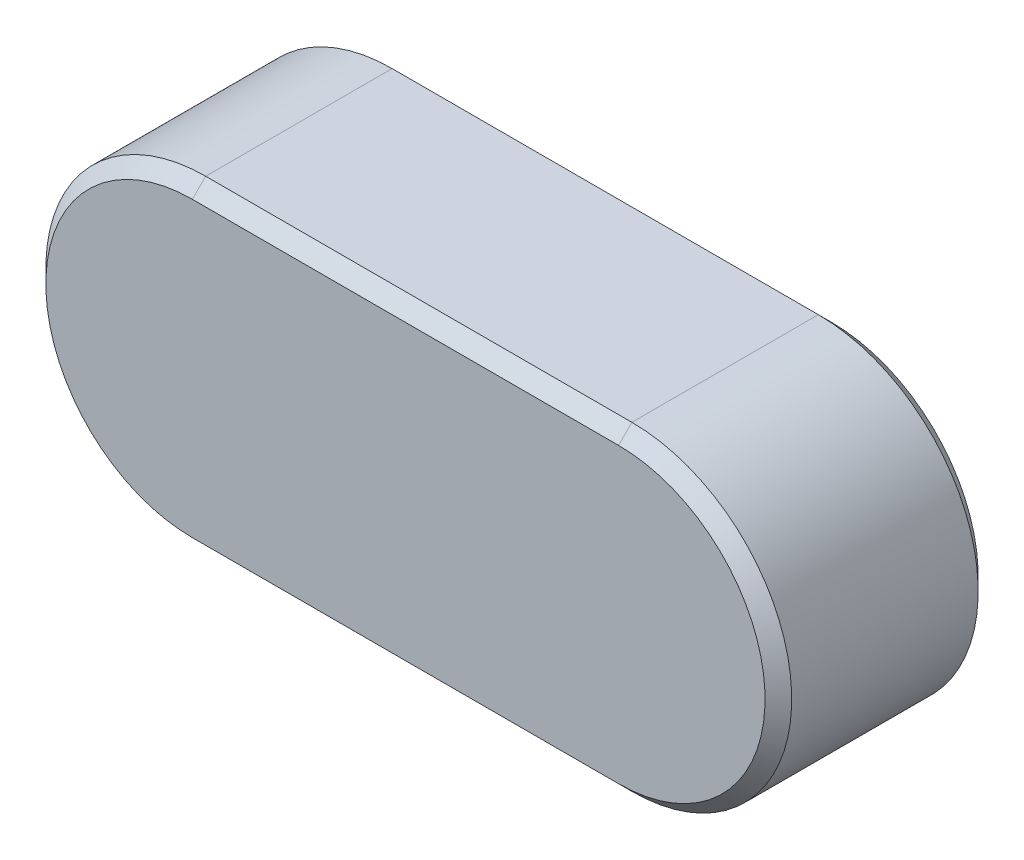
ISO-10303-21;
HEADER;
FILE_DESCRIPTION(('STEP AP214'),'2;1');
FILE_NAME('part.step','',(''),(''),'','','');
FILE_SCHEMA(('AUTOMOTIVE_DESIGN { 1 0 10303 214 1 1 1 1 }'));
ENDSEC;
DATA;
#1=APPLICATION_CONTEXT('core data for automotive mechanical design processes');
#2=APPLICATION_PROTOCOL_DEFINITION('international standard','automotive_design',2000,#1);
#3=PRODUCT_CONTEXT('',#1,'mechanical');
#4=PRODUCT('Part','Part','',(#3));
#5=PRODUCT_RELATED_PRODUCT_CATEGORY('part','',(#4));
#6=PRODUCT_DEFINITION_FORMATION('','',#4);
#7=PRODUCT_DEFINITION_CONTEXT('part definition',#1,'design');
#8=PRODUCT_DEFINITION('design','',#6,#7);
#9=PRODUCT_DEFINITION_SHAPE('','',#8);
#10=(LENGTH_UNIT() NAMED_UNIT(*) SI_UNIT(.MILLI.,.METRE.));
#11=(NAMED_UNIT(*) PLANE_ANGLE_UNIT() SI_UNIT($,.RADIAN.));
#12=(NAMED_UNIT(*) SI_UNIT($,.STERADIAN.) SOLID_ANGLE_UNIT());
#13=UNCERTAINTY_MEASURE_WITH_UNIT(LENGTH_MEASURE(1.E-05),#10,'distance_accuracy_value','');
#14=(GEOMETRIC_REPRESENTATION_CONTEXT(3) GLOBAL_UNCERTAINTY_ASSIGNED_CONTEXT((#13)) GLOBAL_UNIT_ASSIGNED_CONTEXT((#10,
#11,#12)) REPRESENTATION_CONTEXT('',''));
#15=CARTESIAN_POINT('',(0.,0.,0.));
#16=DIRECTION('',(0.,0.,1.));
#17=DIRECTION('',(1.,0.,0.));
#18=AXIS2_PLACEMENT_3D('',#15,#16,#17);
#19=CARTESIAN_POINT('',(0.,0.,4.));
#20=DIRECTION('',(0.,0.,-1.));
#21=DIRECTION('',(-1.,0.,0.));
#22=AXIS2_PLACEMENT_3D('',#19,#20,#21);
#23=CYLINDRICAL_SURFACE('',#22,3.);
#24=DIRECTION('',(0.,0.,-1.));
#25=VECTOR('',#24,1.);
#26=CARTESIAN_POINT('',(0.,-3.,4.));
#27=LINE('',#26,#25);
#28=CARTESIAN_POINT('',(0.,-3.,3.75));
#29=VERTEX_POINT('',#28);
#30=CARTESIAN_POINT('',(0.,-3.,0.25));
#31=VERTEX_POINT('',#30);
#32=EDGE_CURVE('E159',#29,#31,#27,.T.);
#33=ORIENTED_EDGE('',*,*,#32,.T.);
#34=CARTESIAN_POINT('',(0.,0.,0.25));
#35=DIRECTION('',(0.,0.,1.));
#36=DIRECTION('',(1.,0.,0.));
#37=AXIS2_PLACEMENT_3D('',#34,#35,#36);
#38=CIRCLE('',#37,3.);
#39=CARTESIAN_POINT('',(0.,3.,0.25));
#40=VERTEX_POINT('',#39);
#41=EDGE_CURVE('E183',#31,#40,#38,.T.);
#42=ORIENTED_EDGE('',*,*,#41,.T.);
#43=DIRECTION('',(0.,0.,-1.));
#44=VECTOR('',#43,1.);
#45=CARTESIAN_POINT('',(0.,3.,4.));
#46=LINE('',#45,#44);
#47=CARTESIAN_POINT('',(0.,3.,3.75));
#48=VERTEX_POINT('',#47);
#49=EDGE_CURVE('E128',#48,#40,#46,.T.);
#50=ORIENTED_EDGE('',*,*,#49,.F.);
#51=CARTESIAN_POINT('',(0.,0.,3.75));
#52=DIRECTION('',(0.,0.,1.));
#53=DIRECTION('',(1.,0.,0.));
#54=AXIS2_PLACEMENT_3D('',#51,#52,#53);
#55=CIRCLE('',#54,3.);
#56=EDGE_CURVE('E181',#48,#29,#55,.F.);
#57=ORIENTED_EDGE('',*,*,#56,.T.);
#58=EDGE_LOOP('',(#33,#42,#50,#57));
#59=FACE_BOUND('',#58,.T.);
#60=ADVANCED_FACE('F37',(#59),#23,.T.);
#61=CARTESIAN_POINT('',(0.,3.,4.));
#62=DIRECTION('',(0.,-1.,0.));
#63=DIRECTION('',(1.,0.,0.));
#64=AXIS2_PLACEMENT_3D('',#61,#62,#63);
#65=PLANE('',#64);
#66=ORIENTED_EDGE('',*,*,#49,.T.);
#67=DIRECTION('',(-1.,0.,0.));
#68=VECTOR('',#67,1.);
#69=CARTESIAN_POINT('',(0.,3.,0.25));
#70=LINE('',#69,#68);
#71=CARTESIAN_POINT('',(-8.,3.,0.25));
#72=VERTEX_POINT('',#71);
#73=EDGE_CURVE('E127',#40,#72,#70,.T.);
#74=ORIENTED_EDGE('',*,*,#73,.T.);
#75=DIRECTION('',(0.,0.,-1.));
#76=VECTOR('',#75,1.);
#77=CARTESIAN_POINT('',(-8.,3.,4.));
#78=LINE('',#77,#76);
#79=CARTESIAN_POINT('',(-8.,3.,3.75));
#80=VERTEX_POINT('',#79);
#81=EDGE_CURVE('E110',#80,#72,#78,.T.);
#82=ORIENTED_EDGE('',*,*,#81,.F.);
#83=DIRECTION('',(1.,0.,0.));
#84=VECTOR('',#83,1.);
#85=CARTESIAN_POINT('',(0.,3.,3.75));
#86=LINE('',#85,#84);
#87=EDGE_CURVE('E124',#80,#48,#86,.T.);
#88=ORIENTED_EDGE('',*,*,#87,.T.);
#89=EDGE_LOOP('',(#66,#74,#82,#88));
#90=FACE_BOUND('',#89,.T.);
#91=ADVANCED_FACE('F123',(#90),#65,.F.);
#92=CARTESIAN_POINT('',(-8.,0.,4.));
#93=DIRECTION('',(0.,0.,-1.));
#94=DIRECTION('',(-1.,0.,0.));
#95=AXIS2_PLACEMENT_3D('',#92,#93,#94);
#96=CYLINDRICAL_SURFACE('',#95,3.);
#97=ORIENTED_EDGE('',*,*,#81,.T.);
#98=CARTESIAN_POINT('',(-8.,0.,0.25));
#99=DIRECTION('',(0.,0.,1.));
#100=DIRECTION('',(1.,0.,0.));
#101=AXIS2_PLACEMENT_3D('',#98,#99,#100);
#102=CIRCLE('',#101,3.);
#103=CARTESIAN_POINT('',(-8.,-3.,0.25));
#104=VERTEX_POINT('',#103);
#105=EDGE_CURVE('E116',#72,#104,#102,.T.);
#106=ORIENTED_EDGE('',*,*,#105,.T.);
#107=DIRECTION('',(0.,0.,-1.));
#108=VECTOR('',#107,1.);
#109=CARTESIAN_POINT('',(-8.,-3.,4.));
#110=LINE('',#109,#108);
#111=CARTESIAN_POINT('',(-8.,-3.,3.75));
#112=VERTEX_POINT('',#111);
#113=EDGE_CURVE('E112',#112,#104,#110,.T.);
#114=ORIENTED_EDGE('',*,*,#113,.F.);
#115=CARTESIAN_POINT('',(-8.,0.,3.75));
#116=DIRECTION('',(0.,0.,1.));
#117=DIRECTION('',(1.,0.,0.));
#118=AXIS2_PLACEMENT_3D('',#115,#116,#117);
#119=CIRCLE('',#118,3.);
#120=EDGE_CURVE('E107',#112,#80,#119,.F.);
#121=ORIENTED_EDGE('',*,*,#120,.T.);
#122=EDGE_LOOP('',(#97,#106,#114,#121));
#123=FACE_BOUND('',#122,.T.);
#124=ADVANCED_FACE('F109',(#123),#96,.T.);
#125=CARTESIAN_POINT('',(-8.,-3.,4.));
#126=DIRECTION('',(0.,1.,0.));
#127=DIRECTION('',(-1.,0.,0.));
#128=AXIS2_PLACEMENT_3D('',#125,#126,#127);
#129=PLANE('',#128);
#130=ORIENTED_EDGE('',*,*,#113,.T.);
#131=DIRECTION('',(1.,0.,0.));
#132=VECTOR('',#131,1.);
#133=CARTESIAN_POINT('',(-8.,-3.,0.25));
#134=LINE('',#133,#132);
#135=EDGE_CURVE('E187',#104,#31,#134,.T.);
#136=ORIENTED_EDGE('',*,*,#135,.T.);
#137=ORIENTED_EDGE('',*,*,#32,.F.);
#138=DIRECTION('',(-1.,0.,0.));
#139=VECTOR('',#138,1.);
#140=CARTESIAN_POINT('',(-8.,-3.,3.75));
#141=LINE('',#140,#139);
#142=EDGE_CURVE('E185',#29,#112,#141,.T.);
#143=ORIENTED_EDGE('',*,*,#142,.T.);
#144=EDGE_LOOP('',(#130,#136,#137,#143));
#145=FACE_BOUND('',#144,.T.);
#146=ADVANCED_FACE('F197',(#145),#129,.F.);
#147=CARTESIAN_POINT('',(0.,0.,4.));
#148=DIRECTION('',(0.,0.,1.));
#149=DIRECTION('',(1.,0.,0.));
#150=AXIS2_PLACEMENT_3D('',#147,#148,#149);
#151=PLANE('',#150);
#152=CARTESIAN_POINT('',(0.,0.,4.));
#153=DIRECTION('',(0.,0.,1.));
#154=DIRECTION('',(1.,0.,0.));
#155=AXIS2_PLACEMENT_3D('',#152,#153,#154);
#156=CIRCLE('',#155,2.75);
#157=CARTESIAN_POINT('',(0.,-2.75,4.));
#158=VERTEX_POINT('',#157);
#159=CARTESIAN_POINT('',(0.,2.75,4.));
#160=VERTEX_POINT('',#159);
#161=EDGE_CURVE('E61',#158,#160,#156,.T.);
#162=ORIENTED_EDGE('',*,*,#161,.T.);
#163=DIRECTION('',(-1.,0.,0.));
#164=VECTOR('',#163,1.);
#165=CARTESIAN_POINT('',(-8.,2.75,4.));
#166=LINE('',#165,#164);
#167=CARTESIAN_POINT('',(-8.,2.75,4.));
#168=VERTEX_POINT('',#167);
#169=EDGE_CURVE('E11',#160,#168,#166,.T.);
#170=ORIENTED_EDGE('',*,*,#169,.T.);
#171=CARTESIAN_POINT('',(-8.,0.,4.));
#172=DIRECTION('',(0.,0.,1.));
#173=DIRECTION('',(1.,0.,0.));
#174=AXIS2_PLACEMENT_3D('',#171,#172,#173);
#175=CIRCLE('',#174,2.75);
#176=CARTESIAN_POINT('',(-8.,-2.75,4.));
#177=VERTEX_POINT('',#176);
#178=EDGE_CURVE('E46',#168,#177,#175,.T.);
#179=ORIENTED_EDGE('',*,*,#178,.T.);
#180=DIRECTION('',(1.,0.,0.));
#181=VECTOR('',#180,1.);
#182=CARTESIAN_POINT('',(0.,-2.75,4.));
#183=LINE('',#182,#181);
#184=EDGE_CURVE('E189',#177,#158,#183,.T.);
#185=ORIENTED_EDGE('',*,*,#184,.T.);
#186=EDGE_LOOP('',(#162,#170,#179,#185));
#187=FACE_BOUND('',#186,.T.);
#188=ADVANCED_FACE('F192',(#187),#151,.T.);
#189=CARTESIAN_POINT('',(0.,0.,0.));
#190=DIRECTION('',(0.,0.,1.));
#191=DIRECTION('',(1.,0.,0.));
#192=AXIS2_PLACEMENT_3D('',#189,#190,#191);
#193=PLANE('',#192);
#194=CARTESIAN_POINT('',(-8.,0.,0.));
#195=DIRECTION('',(0.,0.,1.));
#196=DIRECTION('',(1.,0.,0.));
#197=AXIS2_PLACEMENT_3D('',#194,#195,#196);
#198=CIRCLE('',#197,2.75);
#199=CARTESIAN_POINT('',(-8.,-2.75,0.));
#200=VERTEX_POINT('',#199);
#201=CARTESIAN_POINT('',(-8.,2.75,0.));
#202=VERTEX_POINT('',#201);
#203=EDGE_CURVE('E176',#200,#202,#198,.F.);
#204=ORIENTED_EDGE('',*,*,#203,.T.);
#205=DIRECTION('',(1.,0.,0.));
#206=VECTOR('',#205,1.);
#207=CARTESIAN_POINT('',(0.,2.75,0.));
#208=LINE('',#207,#206);
#209=CARTESIAN_POINT('',(0.,2.75,0.));
#210=VERTEX_POINT('',#209);
#211=EDGE_CURVE('E117',#202,#210,#208,.T.);
#212=ORIENTED_EDGE('',*,*,#211,.T.);
#213=CARTESIAN_POINT('',(0.,0.,0.));
#214=DIRECTION('',(0.,0.,1.));
#215=DIRECTION('',(1.,0.,0.));
#216=AXIS2_PLACEMENT_3D('',#213,#214,#215);
#217=CIRCLE('',#216,2.75);
#218=CARTESIAN_POINT('',(0.,-2.75,0.));
#219=VERTEX_POINT('',#218);
#220=EDGE_CURVE('E174',#210,#219,#217,.F.);
#221=ORIENTED_EDGE('',*,*,#220,.T.);
#222=DIRECTION('',(-1.,0.,0.));
#223=VECTOR('',#222,1.);
#224=CARTESIAN_POINT('',(0.,-2.75,0.));
#225=LINE('',#224,#223);
#226=EDGE_CURVE('E172',#219,#200,#225,.T.);
#227=ORIENTED_EDGE('',*,*,#226,.T.);
#228=EDGE_LOOP('',(#204,#212,#221,#227));
#229=FACE_BOUND('',#228,.T.);
#230=ADVANCED_FACE('F224',(#229),#193,.F.);
#231=CARTESIAN_POINT('',(-8.,-3.,0.25));
#232=DIRECTION('',(0.,0.707106781186545,0.70710678118655));
#233=DIRECTION('',(0.,-0.70710678118655,0.707106781186545));
#234=AXIS2_PLACEMENT_3D('',#231,#232,#233);
#235=PLANE('',#234);
#236=DIRECTION('',(0.,-0.70710678118655,0.707106781186545));
#237=VECTOR('',#236,1.);
#238=CARTESIAN_POINT('',(-8.,-2.75,0.));
#239=LINE('',#238,#237);
#240=EDGE_CURVE('E151',#200,#104,#239,.T.);
#241=ORIENTED_EDGE('',*,*,#240,.F.);
#242=ORIENTED_EDGE('',*,*,#226,.F.);
#243=DIRECTION('',(0.,0.70710678118655,-0.707106781186545));
#244=VECTOR('',#243,1.);
#245=CARTESIAN_POINT('',(0.,-3.,0.25));
#246=LINE('',#245,#244);
#247=EDGE_CURVE('E139',#31,#219,#246,.T.);
#248=ORIENTED_EDGE('',*,*,#247,.F.);
#249=ORIENTED_EDGE('',*,*,#135,.F.);
#250=EDGE_LOOP('',(#241,#242,#248,#249));
#251=FACE_BOUND('',#250,.T.);
#252=ADVANCED_FACE('F200',(#251),#235,.F.);
#253=CARTESIAN_POINT('',(0.,0.,0.25));
#254=DIRECTION('',(0.,0.,1.));
#255=DIRECTION('',(1.,0.,0.));
#256=AXIS2_PLACEMENT_3D('',#253,#254,#255);
#257=CONICAL_SURFACE('',#256,3.,0.785398163397452);
#258=ORIENTED_EDGE('',*,*,#247,.T.);
#259=ORIENTED_EDGE('',*,*,#220,.F.);
#260=DIRECTION('',(0.,-0.70710678118655,-0.707106781186545));
#261=VECTOR('',#260,1.);
#262=CARTESIAN_POINT('',(0.,3.,0.25));
#263=LINE('',#262,#261);
#264=EDGE_CURVE('E145',#40,#210,#263,.T.);
#265=ORIENTED_EDGE('',*,*,#264,.F.);
#266=ORIENTED_EDGE('',*,*,#41,.F.);
#267=EDGE_LOOP('',(#258,#259,#265,#266));
#268=FACE_BOUND('',#267,.T.);
#269=ADVANCED_FACE('F203',(#268),#257,.T.);
#270=CARTESIAN_POINT('',(-8.,0.,0.25));
#271=DIRECTION('',(0.,0.,1.));
#272=DIRECTION('',(1.,0.,0.));
#273=AXIS2_PLACEMENT_3D('',#270,#271,#272);
#274=CONICAL_SURFACE('',#273,3.,0.785398163397452);
#275=ORIENTED_EDGE('',*,*,#240,.T.);
#276=ORIENTED_EDGE('',*,*,#105,.F.);
#277=DIRECTION('',(0.,0.70710678118655,0.707106781186545));
#278=VECTOR('',#277,1.);
#279=CARTESIAN_POINT('',(-8.,2.75,0.));
#280=LINE('',#279,#278);
#281=EDGE_CURVE('E142',#202,#72,#280,.T.);
#282=ORIENTED_EDGE('',*,*,#281,.F.);
#283=ORIENTED_EDGE('',*,*,#203,.F.);
#284=EDGE_LOOP('',(#275,#276,#282,#283));
#285=FACE_BOUND('',#284,.T.);
#286=ADVANCED_FACE('F206',(#285),#274,.T.);
#287=CARTESIAN_POINT('',(0.,3.,0.25));
#288=DIRECTION('',(0.,-0.707106781186545,0.70710678118655));
#289=DIRECTION('',(0.,-0.70710678118655,-0.707106781186545));
#290=AXIS2_PLACEMENT_3D('',#287,#288,#289);
#291=PLANE('',#290);
#292=ORIENTED_EDGE('',*,*,#264,.T.);
#293=ORIENTED_EDGE('',*,*,#211,.F.);
#294=ORIENTED_EDGE('',*,*,#281,.T.);
#295=ORIENTED_EDGE('',*,*,#73,.F.);
#296=EDGE_LOOP('',(#292,#293,#294,#295));
#297=FACE_BOUND('',#296,.T.);
#298=ADVANCED_FACE('F204',(#297),#291,.F.);
#299=CARTESIAN_POINT('',(0.,-2.75,4.));
#300=DIRECTION('',(0.,-0.70710678118655,0.707106781186545));
#301=DIRECTION('',(0.,-0.707106781186545,-0.70710678118655));
#302=AXIS2_PLACEMENT_3D('',#299,#300,#301);
#303=PLANE('',#302);
#304=DIRECTION('',(0.,0.707106781186545,0.70710678118655));
#305=VECTOR('',#304,1.);
#306=CARTESIAN_POINT('',(-8.,-3.,3.75));
#307=LINE('',#306,#305);
#308=EDGE_CURVE('E136',#112,#177,#307,.T.);
#309=ORIENTED_EDGE('',*,*,#308,.F.);
#310=ORIENTED_EDGE('',*,*,#142,.F.);
#311=DIRECTION('',(0.,-0.707106781186545,-0.70710678118655));
#312=VECTOR('',#311,1.);
#313=CARTESIAN_POINT('',(0.,-2.75,4.));
#314=LINE('',#313,#312);
#315=EDGE_CURVE('E41',#158,#29,#314,.T.);
#316=ORIENTED_EDGE('',*,*,#315,.F.);
#317=ORIENTED_EDGE('',*,*,#184,.F.);
#318=EDGE_LOOP('',(#309,#310,#316,#317));
#319=FACE_BOUND('',#318,.T.);
#320=ADVANCED_FACE('F39',(#319),#303,.T.);
#321=CARTESIAN_POINT('',(0.,0.,4.));
#322=DIRECTION('',(0.,0.,-1.));
#323=DIRECTION('',(-1.,0.,0.));
#324=AXIS2_PLACEMENT_3D('',#321,#322,#323);
#325=CONICAL_SURFACE('',#324,2.75,0.785398163397445);
#326=ORIENTED_EDGE('',*,*,#315,.T.);
#327=ORIENTED_EDGE('',*,*,#56,.F.);
#328=DIRECTION('',(0.,0.707106781186545,-0.70710678118655));
#329=VECTOR('',#328,1.);
#330=CARTESIAN_POINT('',(0.,2.75,4.));
#331=LINE('',#330,#329);
#332=EDGE_CURVE('E131',#160,#48,#331,.T.);
#333=ORIENTED_EDGE('',*,*,#332,.F.);
#334=ORIENTED_EDGE('',*,*,#161,.F.);
#335=EDGE_LOOP('',(#326,#327,#333,#334));
#336=FACE_BOUND('',#335,.T.);
#337=ADVANCED_FACE('F195',(#336),#325,.T.);
#338=CARTESIAN_POINT('',(-8.,0.,4.));
#339=DIRECTION('',(0.,0.,-1.));
#340=DIRECTION('',(-1.,0.,0.));
#341=AXIS2_PLACEMENT_3D('',#338,#339,#340);
#342=CONICAL_SURFACE('',#341,2.75,0.785398163397445);
#343=ORIENTED_EDGE('',*,*,#308,.T.);
#344=ORIENTED_EDGE('',*,*,#178,.F.);
#345=DIRECTION('',(0.,-0.707106781186545,0.70710678118655));
#346=VECTOR('',#345,1.);
#347=CARTESIAN_POINT('',(-8.,3.,3.75));
#348=LINE('',#347,#346);
#349=EDGE_CURVE('E54',#80,#168,#348,.T.);
#350=ORIENTED_EDGE('',*,*,#349,.F.);
#351=ORIENTED_EDGE('',*,*,#120,.F.);
#352=EDGE_LOOP('',(#343,#344,#350,#351));
#353=FACE_BOUND('',#352,.T.);
#354=ADVANCED_FACE('F134',(#353),#342,.T.);
#355=CARTESIAN_POINT('',(0.,2.75,4.));
#356=DIRECTION('',(0.,0.70710678118655,0.707106781186545));
#357=DIRECTION('',(0.,-0.707106781186545,0.70710678118655));
#358=AXIS2_PLACEMENT_3D('',#355,#356,#357);
#359=PLANE('',#358);
#360=ORIENTED_EDGE('',*,*,#332,.T.);
#361=ORIENTED_EDGE('',*,*,#87,.F.);
#362=ORIENTED_EDGE('',*,*,#349,.T.);
#363=ORIENTED_EDGE('',*,*,#169,.F.);
#364=EDGE_LOOP('',(#360,#361,#362,#363));
#365=FACE_BOUND('',#364,.T.);
#366=ADVANCED_FACE('F130',(#365),#359,.T.);
#367=CLOSED_SHELL('',(#60,#91,#124,#146,#188,#230,#252,#269,#286,#298,#320,#337,#354,#366));
#368=MANIFOLD_SOLID_BREP('B2',#367);
#369=ADVANCED_BREP_SHAPE_REPRESENTATION('',(#18,#368),#14);
#370=SHAPE_DEFINITION_REPRESENTATION(#9,#369);
ENDSEC;
END-ISO-10303-21;
